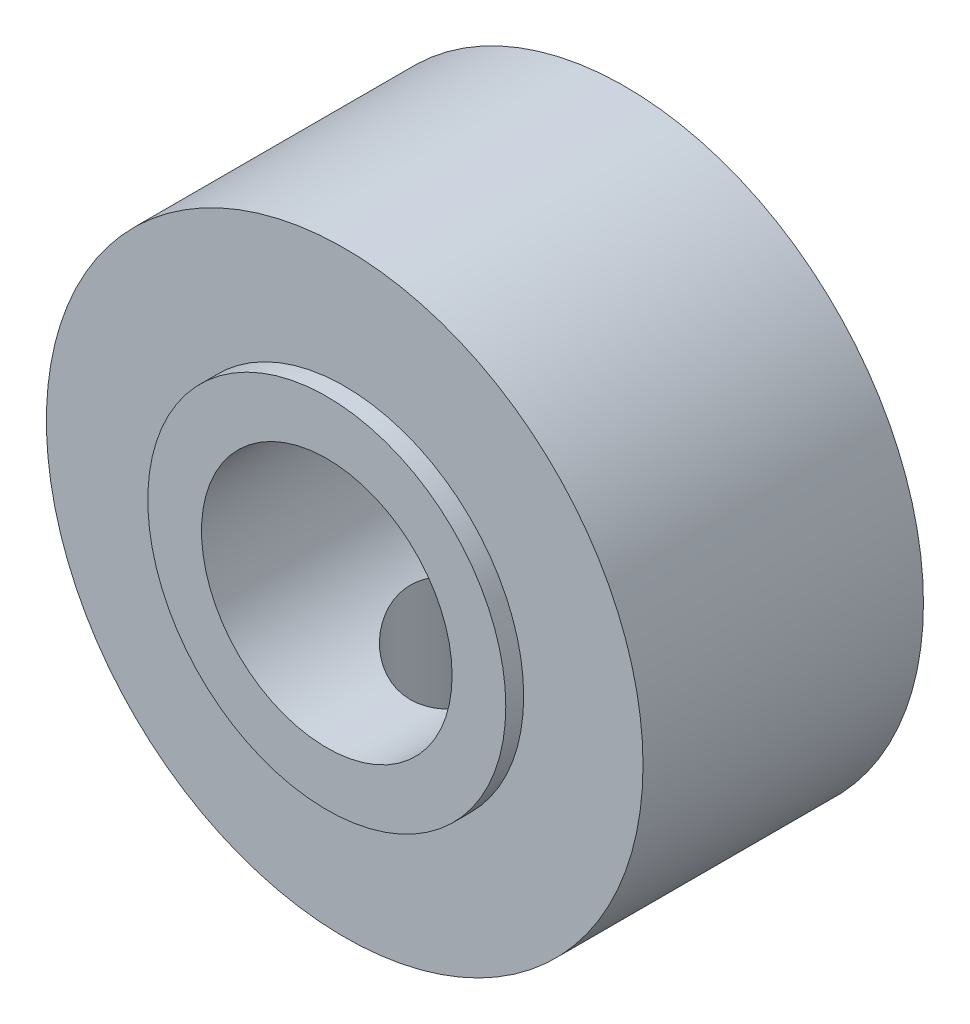
ISO-10303-21;
HEADER;
FILE_DESCRIPTION(('STEP AP214'),'2;1');
FILE_NAME('part.step','',(''),(''),'','','');
FILE_SCHEMA(('AUTOMOTIVE_DESIGN { 1 0 10303 214 1 1 1 1 }'));
ENDSEC;
DATA;
#1=APPLICATION_CONTEXT('core data for automotive mechanical design processes');
#2=APPLICATION_PROTOCOL_DEFINITION('international standard','automotive_design',2000,#1);
#3=PRODUCT_CONTEXT('',#1,'mechanical');
#4=PRODUCT('Part','Part','',(#3));
#5=PRODUCT_RELATED_PRODUCT_CATEGORY('part','',(#4));
#6=PRODUCT_DEFINITION_FORMATION('','',#4);
#7=PRODUCT_DEFINITION_CONTEXT('part definition',#1,'design');
#8=PRODUCT_DEFINITION('design','',#6,#7);
#9=PRODUCT_DEFINITION_SHAPE('','',#8);
#10=(LENGTH_UNIT() NAMED_UNIT(*) SI_UNIT(.MILLI.,.METRE.));
#11=(NAMED_UNIT(*) PLANE_ANGLE_UNIT() SI_UNIT($,.RADIAN.));
#12=(NAMED_UNIT(*) SI_UNIT($,.STERADIAN.) SOLID_ANGLE_UNIT());
#13=UNCERTAINTY_MEASURE_WITH_UNIT(LENGTH_MEASURE(1.E-05),#10,'distance_accuracy_value','');
#14=(GEOMETRIC_REPRESENTATION_CONTEXT(3) GLOBAL_UNCERTAINTY_ASSIGNED_CONTEXT((#13)) GLOBAL_UNIT_ASSIGNED_CONTEXT((#10,
#11,#12)) REPRESENTATION_CONTEXT('',''));
#15=CARTESIAN_POINT('',(0.,0.,0.));
#16=DIRECTION('',(0.,0.,1.));
#17=DIRECTION('',(1.,0.,0.));
#18=AXIS2_PLACEMENT_3D('',#15,#16,#17);
#19=CARTESIAN_POINT('',(0.,0.,4.7));
#20=DIRECTION('',(0.,0.,1.));
#21=DIRECTION('',(1.,0.,0.));
#22=AXIS2_PLACEMENT_3D('',#19,#20,#21);
#23=PLANE('',#22);
#24=CARTESIAN_POINT('',(0.,0.,4.7));
#25=DIRECTION('',(0.,0.,1.));
#26=DIRECTION('',(1.,0.,0.));
#27=AXIS2_PLACEMENT_3D('',#24,#25,#26);
#28=CIRCLE('',#27,5.);
#29=CARTESIAN_POINT('',(5.,0.,4.7));
#30=VERTEX_POINT('',#29);
#31=EDGE_CURVE('E11',#30,#30,#28,.T.);
#32=ORIENTED_EDGE('',*,*,#31,.T.);
#33=EDGE_LOOP('',(#32));
#34=FACE_BOUND('',#33,.T.);
#35=CARTESIAN_POINT('',(0.,0.,4.7));
#36=DIRECTION('',(0.,0.,1.));
#37=DIRECTION('',(1.,0.,0.));
#38=AXIS2_PLACEMENT_3D('',#35,#36,#37);
#39=CIRCLE('',#38,3.);
#40=CARTESIAN_POINT('',(3.,0.,4.7));
#41=VERTEX_POINT('',#40);
#42=EDGE_CURVE('E57',#41,#41,#39,.T.);
#43=ORIENTED_EDGE('',*,*,#42,.F.);
#44=EDGE_LOOP('',(#43));
#45=FACE_BOUND('',#44,.T.);
#46=ADVANCED_FACE('F35',(#34,#45),#23,.T.);
#47=CARTESIAN_POINT('',(0.,0.,4.7));
#48=DIRECTION('',(0.,0.,-1.));
#49=DIRECTION('',(-1.,0.,0.));
#50=AXIS2_PLACEMENT_3D('',#47,#48,#49);
#51=CYLINDRICAL_SURFACE('',#50,5.);
#52=CARTESIAN_POINT('',(0.,-5.,3.6));
#53=CARTESIAN_POINT('',(0.0690634072247759,-4.99999883223344,3.59999806188487));
#54=CARTESIAN_POINT('',(0.138148464858969,-4.99855481776523,3.59425704102184));
#55=CARTESIAN_POINT('',(0.274338603142111,-4.99293428191577,3.5714790405775));
#56=CARTESIAN_POINT('',(0.341442539058949,-4.98875621183307,3.55443565871846));
#57=CARTESIAN_POINT('',(0.471684060152148,-4.97813021943366,3.50963395544826));
#58=CARTESIAN_POINT('',(0.534826302858336,-4.97168502368406,3.4818885010706));
#59=CARTESIAN_POINT('',(0.655560109920356,-4.95721119839661,3.41651550829597));
#60=CARTESIAN_POINT('',(0.713151486957299,-4.94918251545042,3.37888763656755));
#61=CARTESIAN_POINT('',(0.822334939417433,-4.93222844659834,3.29399934195482));
#62=CARTESIAN_POINT('',(0.873796408384226,-4.92328922623777,3.24657368753402));
#63=CARTESIAN_POINT('',(0.968124106002753,-4.90561350097941,3.14378982924257));
#64=CARTESIAN_POINT('',(1.01098936412428,-4.89687701906957,3.08843073087792));
#65=CARTESIAN_POINT('',(1.08752211899919,-4.88045646416425,2.97033731105214));
#66=CARTESIAN_POINT('',(1.12104351327113,-4.87278995392171,2.90750564099133));
#67=CARTESIAN_POINT('',(1.17699742379211,-4.85957912343519,2.77687632361803));
#68=CARTESIAN_POINT('',(1.19943171286611,-4.85403446393991,2.70907947222853));
#69=CARTESIAN_POINT('',(1.23212903067024,-4.84583730597959,2.5718804181646));
#70=CARTESIAN_POINT('',(1.24262689027778,-4.84312909229522,2.50253758662517));
#71=CARTESIAN_POINT('',(1.25188481255654,-4.84074468781451,2.36302619248835));
#72=CARTESIAN_POINT('',(1.25064678484831,-4.8410680037387,2.29285776608449));
#73=CARTESIAN_POINT('',(1.2366554371994,-4.84466004580515,2.1554868268796));
#74=CARTESIAN_POINT('',(1.22418195015877,-4.84785719168233,2.08825364877909));
#75=CARTESIAN_POINT('',(1.18852015575259,-4.85672258063736,1.95686579090726));
#76=CARTESIAN_POINT('',(1.16533108505785,-4.8623909997558,1.89271133080918));
#77=CARTESIAN_POINT('',(1.10865789828096,-4.87562594920155,1.76855165312328));
#78=CARTESIAN_POINT('',(1.07507222269409,-4.88321106224518,1.70859485684204));
#79=CARTESIAN_POINT('',(0.998630230012462,-4.89941425705322,1.5950677418693));
#80=CARTESIAN_POINT('',(0.955772290674033,-4.90803251945613,1.54149854327729));
#81=CARTESIAN_POINT('',(0.860552853901015,-4.92563233783151,1.440663653588));
#82=CARTESIAN_POINT('',(0.807955215138216,-4.93461724564976,1.39362125828221));
#83=CARTESIAN_POINT('',(0.695509931253083,-4.95171637982321,1.30898229794675));
#84=CARTESIAN_POINT('',(0.63566206475662,-4.95983057957846,1.27138602144703));
#85=CARTESIAN_POINT('',(0.51009657390116,-4.97431443411819,1.20662451147968));
#86=CARTESIAN_POINT('',(0.444359494340519,-4.98067800106438,1.17949554978798));
#87=CARTESIAN_POINT('',(0.309063340119069,-4.99089930826182,1.13673557857536));
#88=CARTESIAN_POINT('',(0.239504999292071,-4.99475752782734,1.12110236965155));
#89=CARTESIAN_POINT('',(0.100449975325023,-4.99946249392812,1.10211869536764));
#90=CARTESIAN_POINT('',(0.0309972666568416,-5.00038377923565,1.09846414493725));
#91=CARTESIAN_POINT('',(-0.107527395667923,-4.99932337345376,1.10270750171291));
#92=CARTESIAN_POINT('',(-0.176599383037162,-4.99734194368205,1.11060436899928));
#93=CARTESIAN_POINT('',(-0.311345223980409,-4.99074650939464,1.13747575699282));
#94=CARTESIAN_POINT('',(-0.377054265807295,-4.98617195154843,1.15628438623082));
#95=CARTESIAN_POINT('',(-0.504381077043759,-4.97490588861778,1.20425590335704));
#96=CARTESIAN_POINT('',(-0.565998432527195,-4.9682141697491,1.23341983692764));
#97=CARTESIAN_POINT('',(-0.684602612024872,-4.95327756605259,1.30186344072894));
#98=CARTESIAN_POINT('',(-0.741487868196525,-4.94500722805777,1.3413134269973));
#99=CARTESIAN_POINT('',(-0.847938844702705,-4.92787090989516,1.42899159066414));
#100=CARTESIAN_POINT('',(-0.897503299144173,-4.91900482709754,1.47722128301409));
#101=CARTESIAN_POINT('',(-0.989158806727275,-4.90140797467309,1.58250163403705));
#102=CARTESIAN_POINT('',(-1.03103655635169,-4.89268586822734,1.63973975250202));
#103=CARTESIAN_POINT('',(-1.10459229917725,-4.87660731981032,1.76061052872143));
#104=CARTESIAN_POINT('',(-1.13627074513161,-4.86925081722522,1.82424290246646));
#105=CARTESIAN_POINT('',(-1.18829285050774,-4.85681745612221,1.95575476867756));
#106=CARTESIAN_POINT('',(-1.20870366387839,-4.85172712743255,2.02360635695334));
#107=CARTESIAN_POINT('',(-1.23778804996148,-4.84438953408486,2.16192469824092));
#108=CARTESIAN_POINT('',(-1.24646418956555,-4.84214164766613,2.23239087586041));
#109=CARTESIAN_POINT('',(-1.25169882527833,-4.84079084336631,2.37176751987934));
#110=CARTESIAN_POINT('',(-1.2485982481501,-4.8415994394022,2.44066452927061));
#111=CARTESIAN_POINT('',(-1.23114773192739,-4.84606590839869,2.57691990722332));
#112=CARTESIAN_POINT('',(-1.21679801890564,-4.84972372409881,2.64427830667804));
#113=CARTESIAN_POINT('',(-1.17744276620233,-4.85942717235602,2.77517371588784));
#114=CARTESIAN_POINT('',(-1.15250117056698,-4.86545846030258,2.83873108770017));
#115=CARTESIAN_POINT('',(-1.09272076133756,-4.8792312977069,2.96080448559474));
#116=CARTESIAN_POINT('',(-1.05788057502849,-4.88697308433977,3.0193198109891));
#117=CARTESIAN_POINT('',(-0.97822312386428,-4.90354695219593,3.13129552416835));
#118=CARTESIAN_POINT('',(-0.933169302426879,-4.91240220693131,3.1845842278533));
#119=CARTESIAN_POINT('',(-0.834824475991446,-4.93006689371905,3.28295587066284));
#120=CARTESIAN_POINT('',(-0.781531517717622,-4.93887631439216,3.32803685842747));
#121=CARTESIAN_POINT('',(-0.667056322252159,-4.95564713039719,3.40950942380384));
#122=CARTESIAN_POINT('',(-0.605748685263656,-4.9635902780489,3.44572884472632));
#123=CARTESIAN_POINT('',(-0.47772171625873,-4.97754104145932,3.50728955245044));
#124=CARTESIAN_POINT('',(-0.41100630286395,-4.98355004333151,3.53263863387378));
#125=CARTESIAN_POINT('',(-0.28700854436956,-4.99206716304618,3.56797652527471));
#126=CARTESIAN_POINT('',(-0.230316809090058,-4.99502154210576,3.57995936921119));
#127=CARTESIAN_POINT('',(-0.11575505961357,-4.9989883769329,3.59597161968495));
#128=CARTESIAN_POINT('',(-0.057885134368847,-5.00000097875745,3.60000162442108));
#129=CARTESIAN_POINT('',(0.,-5.,3.6));
#130=B_SPLINE_CURVE_WITH_KNOTS('',3,(#52,#53,#54,#55,#56,#57,#58,#59,#60,#61,#62,#63,#64,#65,
#66,#67,#68,#69,#70,#71,#72,#73,#74,#75,#76,#77,#78,#79,#80,#81,#82,#83,#84,#85,#86,#87,#88,#89,
#90,#91,#92,#93,#94,#95,#96,#97,#98,#99,#100,#101,#102,#103,#104,#105,#106,#107,#108,#109,#110,
#111,#112,#113,#114,#115,#116,#117,#118,#119,#120,#121,#122,#123,#124,#125,#126,#127,#128,#129),
.UNSPECIFIED.,.T.,.F.,(4,2,2,2,2,2,2,2,2,2,2,2,2,2,2,2,2,2,2,2,2,2,2,2,2,2,2,2,2,2,2,2,2,2,2,2,
2,2,4),(0.,0.206978093726575,0.414073531469916,0.620920751905088,0.827774950141107,
1.03845362864282,1.24915607983385,1.46298872954839,1.6767871764114,1.88630245916192,
2.09578365093914,2.30018747505848,2.50460586221699,2.71108773228233,2.91760575696802,
3.13001250807516,3.34242574631873,3.55556857507595,3.76867061407202,3.97631924124397,
4.18394917593952,4.38850228761698,4.59307606101909,4.80127989637793,5.00951969173349,
5.2228709100373,5.4362126562459,5.6482687884503,5.8602785271034,6.06619816998844,
6.27211367463362,6.47680333799539,6.68152140114084,6.89157980341592,7.10168808142015,
7.3156015458299,7.52936136517792,7.70285202451791,7.876329633692),.UNSPECIFIED.);
#131=CARTESIAN_POINT('',(0.,-5.,3.6));
#132=VERTEX_POINT('',#131);
#133=EDGE_CURVE('E64',#132,#132,#130,.T.);
#134=ORIENTED_EDGE('',*,*,#133,.T.);
#135=EDGE_LOOP('',(#134));
#136=FACE_BOUND('',#135,.T.);
#137=ORIENTED_EDGE('',*,*,#31,.F.);
#138=EDGE_LOOP('',(#137));
#139=FACE_BOUND('',#138,.T.);
#140=CARTESIAN_POINT('',(0.,0.,0.));
#141=DIRECTION('',(0.,0.,1.));
#142=DIRECTION('',(1.,0.,0.));
#143=AXIS2_PLACEMENT_3D('',#140,#141,#142);
#144=CIRCLE('',#143,5.);
#145=CARTESIAN_POINT('',(5.,0.,0.));
#146=VERTEX_POINT('',#145);
#147=EDGE_CURVE('E48',#146,#146,#144,.T.);
#148=ORIENTED_EDGE('',*,*,#147,.T.);
#149=EDGE_LOOP('',(#148));
#150=FACE_BOUND('',#149,.T.);
#151=ADVANCED_FACE('F37',(#136,#139,#150),#51,.T.);
#152=CARTESIAN_POINT('',(0.,0.,0.));
#153=DIRECTION('',(0.,0.,1.));
#154=DIRECTION('',(1.,0.,0.));
#155=AXIS2_PLACEMENT_3D('',#152,#153,#154);
#156=PLANE('',#155);
#157=CARTESIAN_POINT('',(0.,0.,0.));
#158=DIRECTION('',(0.,0.,1.));
#159=DIRECTION('',(1.,0.,0.));
#160=AXIS2_PLACEMENT_3D('',#157,#158,#159);
#161=CIRCLE('',#160,2.1);
#162=CARTESIAN_POINT('',(2.1,0.,0.));
#163=VERTEX_POINT('',#162);
#164=EDGE_CURVE('E60',#163,#163,#161,.T.);
#165=ORIENTED_EDGE('',*,*,#164,.T.);
#166=EDGE_LOOP('',(#165));
#167=FACE_BOUND('',#166,.T.);
#168=ORIENTED_EDGE('',*,*,#147,.F.);
#169=EDGE_LOOP('',(#168));
#170=FACE_BOUND('',#169,.T.);
#171=ADVANCED_FACE('F84',(#167,#170),#156,.F.);
#172=CARTESIAN_POINT('',(0.,0.,18.4852813742386));
#173=DIRECTION('',(0.,0.,-1.));
#174=DIRECTION('',(-1.,0.,0.));
#175=AXIS2_PLACEMENT_3D('',#172,#173,#174);
#176=CYLINDRICAL_SURFACE('',#175,3.);
#177=ORIENTED_EDGE('',*,*,#42,.T.);
#178=EDGE_LOOP('',(#177));
#179=FACE_BOUND('',#178,.T.);
#180=CARTESIAN_POINT('',(0.,0.,5.));
#181=DIRECTION('',(0.,0.,1.));
#182=DIRECTION('',(1.,0.,0.));
#183=AXIS2_PLACEMENT_3D('',#180,#181,#182);
#184=CIRCLE('',#183,3.);
#185=CARTESIAN_POINT('',(3.,0.,5.));
#186=VERTEX_POINT('',#185);
#187=EDGE_CURVE('E53',#186,#186,#184,.T.);
#188=ORIENTED_EDGE('',*,*,#187,.F.);
#189=EDGE_LOOP('',(#188));
#190=FACE_BOUND('',#189,.T.);
#191=ADVANCED_FACE('F81',(#179,#190),#176,.T.);
#192=CARTESIAN_POINT('',(0.,0.,5.));
#193=DIRECTION('',(0.,0.,1.));
#194=DIRECTION('',(1.,0.,0.));
#195=AXIS2_PLACEMENT_3D('',#192,#193,#194);
#196=PLANE('',#195);
#197=CARTESIAN_POINT('',(0.,0.,5.));
#198=DIRECTION('',(0.,0.,1.));
#199=DIRECTION('',(1.,0.,0.));
#200=AXIS2_PLACEMENT_3D('',#197,#198,#199);
#201=CIRCLE('',#200,2.1);
#202=CARTESIAN_POINT('',(2.1,0.,5.));
#203=VERTEX_POINT('',#202);
#204=EDGE_CURVE('E61',#203,#203,#201,.T.);
#205=ORIENTED_EDGE('',*,*,#204,.F.);
#206=EDGE_LOOP('',(#205));
#207=FACE_BOUND('',#206,.T.);
#208=ORIENTED_EDGE('',*,*,#187,.T.);
#209=EDGE_LOOP('',(#208));
#210=FACE_BOUND('',#209,.T.);
#211=ADVANCED_FACE('F79',(#207,#210),#196,.T.);
#212=CARTESIAN_POINT('',(0.,0.,0.));
#213=DIRECTION('',(0.,0.,1.));
#214=DIRECTION('',(1.,0.,0.));
#215=AXIS2_PLACEMENT_3D('',#212,#213,#214);
#216=CYLINDRICAL_SURFACE('',#215,2.1);
#217=CARTESIAN_POINT('',(0.,-2.1,3.6));
#218=CARTESIAN_POINT('',(-0.0640226775460212,-2.0999971621291,3.59999688604095));
#219=CARTESIAN_POINT('',(-0.128152585956535,-2.09704010748215,3.59504670673764));
#220=CARTESIAN_POINT('',(-0.254490052465576,-2.08549318076383,3.57549669407342));
#221=CARTESIAN_POINT('',(-0.316692250134422,-2.07688886081917,3.56087210910711));
#222=CARTESIAN_POINT('',(-0.437071541174812,-2.05491948806018,3.52278899216858));
#223=CARTESIAN_POINT('',(-0.495266909771825,-2.04157803425589,3.49937421779307));
#224=CARTESIAN_POINT('',(-0.606722922250695,-2.01127508514269,3.44464414389886));
#225=CARTESIAN_POINT('',(-0.659984917956791,-1.99431458574446,3.41333101746527));
#226=CARTESIAN_POINT('',(-0.76463359604843,-1.95669521688118,3.3410505974036));
#227=CARTESIAN_POINT('',(-0.815572146928483,-1.93585346459021,3.29953145232071));
#228=CARTESIAN_POINT('',(-0.91020043493589,-1.89320764923087,3.20925516030214));
#229=CARTESIAN_POINT('',(-0.953880818837085,-1.87140238962514,3.1604888251701));
#230=CARTESIAN_POINT('',(-1.03807660067336,-1.82618251379141,3.05019581401617));
#231=CARTESIAN_POINT('',(-1.07757997860757,-1.80288962715745,2.98783988565906));
#232=CARTESIAN_POINT('',(-1.14539465089145,-1.76058953983856,2.85600619630544));
#233=CARTESIAN_POINT('',(-1.17372393928513,-1.74157547020438,2.78654011417754));
#234=CARTESIAN_POINT('',(-1.21248373271033,-1.71473066078549,2.6593388305415));
#235=CARTESIAN_POINT('',(-1.22556989258969,-1.70531511442092,2.60274858985345));
#236=CARTESIAN_POINT('',(-1.2437545574258,-1.69210107261266,2.48768294266833));
#237=CARTESIAN_POINT('',(-1.24886275144712,-1.68829576397353,2.42920991104747));
#238=CARTESIAN_POINT('',(-1.25079855338487,-1.68686250841609,2.31194071082016));
#239=CARTESIAN_POINT('',(-1.24761082608099,-1.68924600163593,2.25314414455156));
#240=CARTESIAN_POINT('',(-1.23312335423551,-1.69984796582052,2.13708507933644));
#241=CARTESIAN_POINT('',(-1.22181759180896,-1.70807076540283,2.07982375114378));
#242=CARTESIAN_POINT('',(-1.191860175755,-1.72910246193482,1.96890060925126));
#243=CARTESIAN_POINT('',(-1.1732925825183,-1.74185873198025,1.9152055517297));
#244=CARTESIAN_POINT('',(-1.12948602608815,-1.77057784152447,1.81154695520805));
#245=CARTESIAN_POINT('',(-1.10424459899154,-1.78654186476551,1.76158480310938));
#246=CARTESIAN_POINT('',(-1.04278816280288,-1.8232062705075,1.65765672155948));
#247=CARTESIAN_POINT('',(-1.00543141633342,-1.84424868470571,1.6044861537548));
#248=CARTESIAN_POINT('',(-0.923057115288977,-1.88682783482906,1.50462353206541));
#249=CARTESIAN_POINT('',(-0.878032359435059,-1.90836501880793,1.45793764367753));
#250=CARTESIAN_POINT('',(-0.774372380969883,-1.95293116109966,1.36599353269503));
#251=CARTESIAN_POINT('',(-0.714720551206727,-1.97576967296533,1.32177669012787));
#252=CARTESIAN_POINT('',(-0.587444760428496,-2.01726996029285,1.24412736253286));
#253=CARTESIAN_POINT('',(-0.519825254065018,-2.03593405287387,1.21068889012186));
#254=CARTESIAN_POINT('',(-0.382910433337667,-2.06590582105561,1.15798262291892));
#255=CARTESIAN_POINT('',(-0.31400305902603,-2.0776096407174,1.13794132114503));
#256=CARTESIAN_POINT('',(-0.172994947727035,-2.09406064688739,1.10995081492141));
#257=CARTESIAN_POINT('',(-0.100898019608305,-2.09881591181968,1.10198756805544));
#258=CARTESIAN_POINT('',(0.0340010594324059,-2.10066187521826,1.09888957485223));
#259=CARTESIAN_POINT('',(0.0967605901060243,-2.09869010708976,1.10218571429739));
#260=CARTESIAN_POINT('',(0.220670943201987,-2.0892971447952,1.11804872787285));
#261=CARTESIAN_POINT('',(0.281821786467091,-2.0818760212691,1.13061548182824));
#262=CARTESIAN_POINT('',(0.399548676454895,-2.06248590052886,1.16402884821051));
#263=CARTESIAN_POINT('',(0.456195325667358,-2.05061940361192,1.18468929586215));
#264=CARTESIAN_POINT('',(0.565214901961359,-2.02328795280575,1.23348662059433));
#265=CARTESIAN_POINT('',(0.617586954833794,-2.00782226531477,1.2616250220282));
#266=CARTESIAN_POINT('',(0.722457373172457,-1.97266903715224,1.32784919994779));
#267=CARTESIAN_POINT('',(0.774402244062641,-1.95270968430037,1.36666522501221));
#268=CARTESIAN_POINT('',(0.871437420579424,-1.91138294059351,1.45152399500534));
#269=CARTESIAN_POINT('',(0.916519609641951,-1.89001392465819,1.49757516826184));
#270=CARTESIAN_POINT('',(1.00444659551976,-1.84494563049028,1.60243845312637));
#271=CARTESIAN_POINT('',(1.04627618436864,-1.82129595969321,1.66212874580764));
#272=CARTESIAN_POINT('',(1.11932053409307,-1.77734140104423,1.78879524249638));
#273=CARTESIAN_POINT('',(1.1505470792169,-1.75703281293633,1.8557632479975));
#274=CARTESIAN_POINT('',(1.19556431362432,-1.72661507782045,1.98051221645744));
#275=CARTESIAN_POINT('',(1.21166478294703,-1.71525017371526,2.03715041099507));
#276=CARTESIAN_POINT('',(1.23577331547183,-1.69796630634197,2.1529017690034));
#277=CARTESIAN_POINT('',(1.24379227869636,-1.69204000865983,2.21201148653542));
#278=CARTESIAN_POINT('',(1.2512916036995,-1.68650352972724,2.33128353714004));
#279=CARTESIAN_POINT('',(1.25074264050422,-1.68691504048418,2.39144878098638));
#280=CARTESIAN_POINT('',(1.24106963437792,-1.69404215872105,2.51071845364892));
#281=CARTESIAN_POINT('',(1.23194072476264,-1.70076134401336,2.56982226100972));
#282=CARTESIAN_POINT('',(1.20621151721752,-1.71909460020772,2.6828254604925));
#283=CARTESIAN_POINT('',(1.18994589011906,-1.7304880726455,2.73683929782776));
#284=CARTESIAN_POINT('',(1.15070330311898,-1.75682627473565,2.84143250347804));
#285=CARTESIAN_POINT('',(1.12772382497915,-1.77177233650402,2.89201057431291));
#286=CARTESIAN_POINT('',(1.07163065871195,-1.8063362760832,2.99664933877111));
#287=CARTESIAN_POINT('',(1.03750044859814,-1.82631917037503,3.05004353206803));
#288=CARTESIAN_POINT('',(0.961810730750839,-1.86729082710308,3.15087445880068));
#289=CARTESIAN_POINT('',(0.920245160345235,-1.88828040006966,3.19830627646635));
#290=CARTESIAN_POINT('',(0.823198229533275,-1.93277497696981,3.2934810767948));
#291=CARTESIAN_POINT('',(0.766556979818703,-1.95615910243391,3.34010939052115));
#292=CARTESIAN_POINT('',(0.645031020347061,-1.99952280164545,3.42324208542061));
#293=CARTESIAN_POINT('',(0.580143695653735,-2.01950129069582,3.45974324340349));
#294=CARTESIAN_POINT('',(0.446080134934895,-2.05319694878141,3.51992159869308));
#295=CARTESIAN_POINT('',(0.377140547150738,-2.06711263703509,3.54401104733383));
#296=CARTESIAN_POINT('',(0.235254827997578,-2.08800134577756,3.57982313958579));
#297=CARTESIAN_POINT('',(0.162325054106673,-2.09500075428707,3.5915927977793));
#298=CARTESIAN_POINT('',(0.074134752345584,-2.09874418454867,3.59788882119467));
#299=CARTESIAN_POINT('',(0.0593246260227872,-2.09921430803036,3.59867961890099));
#300=CARTESIAN_POINT('',(0.0296782545394184,-2.0998425488409,3.59973557622602));
#301=CARTESIAN_POINT('',(0.0148420086959616,-2.10000065788727,3.6000007218912));
#302=CARTESIAN_POINT('',(0.,-2.1,3.6));
#303=B_SPLINE_CURVE_WITH_KNOTS('',3,(#217,#218,#219,#220,#221,#222,#223,#224,#225,#226,#227,
#228,#229,#230,#231,#232,#233,#234,#235,#236,#237,#238,#239,#240,#241,#242,#243,#244,#245,#246,
#247,#248,#249,#250,#251,#252,#253,#254,#255,#256,#257,#258,#259,#260,#261,#262,#263,#264,#265,
#266,#267,#268,#269,#270,#271,#272,#273,#274,#275,#276,#277,#278,#279,#280,#281,#282,#283,#284,
#285,#286,#287,#288,#289,#290,#291,#292,#293,#294,#295,#296,#297,#298,#299,#300,#301,#302),
.UNSPECIFIED.,.T.,.F.,(4,2,2,2,2,2,2,2,2,2,2,2,2,2,2,2,2,2,2,2,2,2,2,2,2,2,2,2,2,2,2,2,2,2,2,2,
2,2,2,2,2,2,4),(0.,0.192004033488352,0.384501211905477,0.576052578501204,0.767551300666373,
0.973564827280628,1.17984180795211,1.41092071869248,1.64162598039172,1.8174009735144,
1.99296232530017,2.16884843709784,2.34486506774135,2.51890178389484,2.69300284234917,
2.89712747677768,3.10144487924791,3.33331300711942,3.56505210941058,3.78187668667183,
3.99844898148909,4.18614059402244,4.37382977355366,4.55743388548489,4.74107545318402,
4.94381872781187,5.14679995649728,5.37561800173832,5.60418089922928,5.78334284825227,
5.96226282586766,6.14179531701274,6.32142970338497,6.49341552132849,6.66546593088816,
6.86405919941863,7.06281514197708,7.29269900285768,7.52265594562414,7.74438189628257,
7.96525858040516,8.00976858842738,8.05427977796089),.UNSPECIFIED.);
#304=CARTESIAN_POINT('',(0.,-2.1,3.6));
#305=VERTEX_POINT('',#304);
#306=EDGE_CURVE('E40',#305,#305,#303,.T.);
#307=ORIENTED_EDGE('',*,*,#306,.T.);
#308=EDGE_LOOP('',(#307));
#309=FACE_BOUND('',#308,.T.);
#310=ORIENTED_EDGE('',*,*,#164,.F.);
#311=EDGE_LOOP('',(#310));
#312=FACE_BOUND('',#311,.T.);
#313=ORIENTED_EDGE('',*,*,#204,.T.);
#314=EDGE_LOOP('',(#313));
#315=FACE_BOUND('',#314,.T.);
#316=ADVANCED_FACE('F73',(#309,#312,#315),#216,.F.);
#317=CARTESIAN_POINT('',(0.,-5.,2.35));
#318=DIRECTION('',(0.,1.,0.));
#319=DIRECTION('',(0.,0.,1.));
#320=AXIS2_PLACEMENT_3D('',#317,#318,#319);
#321=CYLINDRICAL_SURFACE('',#320,1.25);
#322=ORIENTED_EDGE('',*,*,#306,.F.);
#323=EDGE_LOOP('',(#322));
#324=FACE_BOUND('',#323,.T.);
#325=ORIENTED_EDGE('',*,*,#133,.F.);
#326=EDGE_LOOP('',(#325));
#327=FACE_BOUND('',#326,.T.);
#328=ADVANCED_FACE('F70',(#324,#327),#321,.F.);
#329=CLOSED_SHELL('',(#46,#151,#171,#191,#211,#316,#328));
#330=MANIFOLD_SOLID_BREP('B2',#329);
#331=ADVANCED_BREP_SHAPE_REPRESENTATION('',(#18,#330),#14);
#332=SHAPE_DEFINITION_REPRESENTATION(#9,#331);
ENDSEC;
END-ISO-10303-21;
